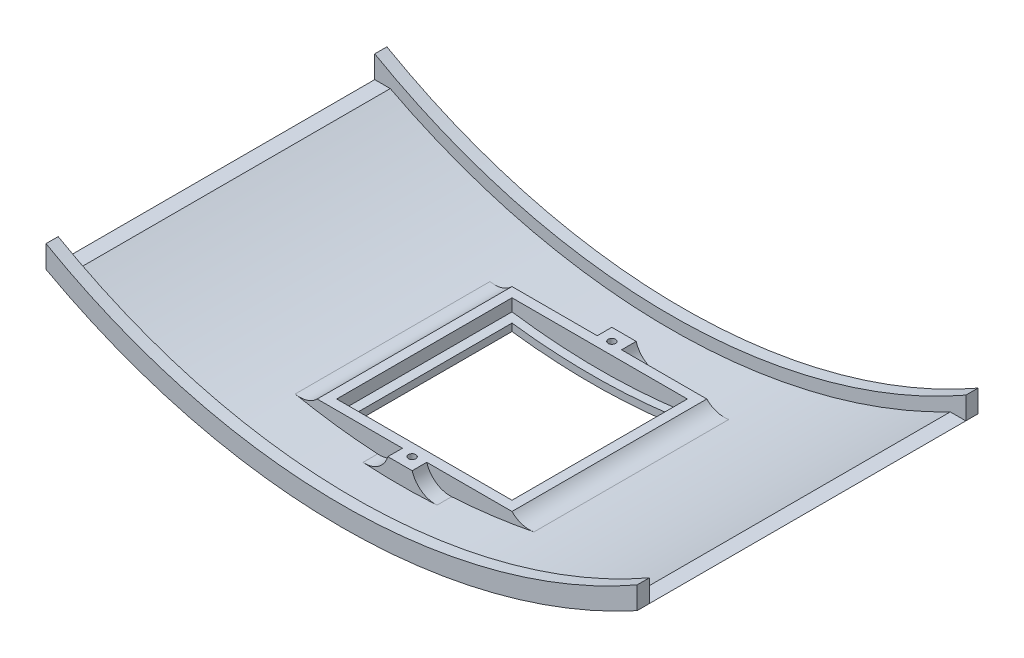
ISO-10303-21;
HEADER;
FILE_DESCRIPTION(('STEP AP214'),'2;1');
FILE_NAME('part.step','',(''),(''),'','','');
FILE_SCHEMA(('AUTOMOTIVE_DESIGN { 1 0 10303 214 1 1 1 1 }'));
ENDSEC;
DATA;
#1=APPLICATION_CONTEXT('core data for automotive mechanical design processes');
#2=APPLICATION_PROTOCOL_DEFINITION('international standard','automotive_design',2000,#1);
#3=PRODUCT_CONTEXT('',#1,'mechanical');
#4=PRODUCT('Part','Part','',(#3));
#5=PRODUCT_RELATED_PRODUCT_CATEGORY('part','',(#4));
#6=PRODUCT_DEFINITION_FORMATION('','',#4);
#7=PRODUCT_DEFINITION_CONTEXT('part definition',#1,'design');
#8=PRODUCT_DEFINITION('design','',#6,#7);
#9=PRODUCT_DEFINITION_SHAPE('','',#8);
#10=(LENGTH_UNIT() NAMED_UNIT(*) SI_UNIT(.MILLI.,.METRE.));
#11=(NAMED_UNIT(*) PLANE_ANGLE_UNIT() SI_UNIT($,.RADIAN.));
#12=(NAMED_UNIT(*) SI_UNIT($,.STERADIAN.) SOLID_ANGLE_UNIT());
#13=UNCERTAINTY_MEASURE_WITH_UNIT(LENGTH_MEASURE(1.E-05),#10,'distance_accuracy_value','');
#14=(GEOMETRIC_REPRESENTATION_CONTEXT(3) GLOBAL_UNCERTAINTY_ASSIGNED_CONTEXT((#13)) GLOBAL_UNIT_ASSIGNED_CONTEXT((#10,
#11,#12)) REPRESENTATION_CONTEXT('',''));
#15=CARTESIAN_POINT('',(0.,0.,0.));
#16=DIRECTION('',(0.,0.,1.));
#17=DIRECTION('',(1.,0.,0.));
#18=AXIS2_PLACEMENT_3D('',#15,#16,#17);
#19=CARTESIAN_POINT('',(40.,-242.39,110.));
#20=DIRECTION('',(0.,0.,1.));
#21=DIRECTION('',(1.,0.,0.));
#22=AXIS2_PLACEMENT_3D('',#19,#20,#21);
#23=PLANE('',#22);
#24=CARTESIAN_POINT('',(0.,0.,110.));
#25=DIRECTION('',(0.,0.,1.));
#26=DIRECTION('',(1.,0.,0.));
#27=AXIS2_PLACEMENT_3D('',#24,#25,#26);
#28=CIRCLE('',#27,250.);
#29=CARTESIAN_POINT('',(-49.0495078289305,-245.141073224663,110.));
#30=VERTEX_POINT('',#29);
#31=CARTESIAN_POINT('',(-15.1979695819754,-249.537615842953,110.));
#32=VERTEX_POINT('',#31);
#33=EDGE_CURVE('E356',#30,#32,#28,.T.);
#34=ORIENTED_EDGE('',*,*,#33,.T.);
#35=CARTESIAN_POINT('',(-14.5900507986964,-239.556111209235,110.));
#36=DIRECTION('',(0.,0.,1.));
#37=DIRECTION('',(1.,0.,0.));
#38=AXIS2_PLACEMENT_3D('',#35,#36,#37);
#39=CIRCLE('',#38,10.);
#40=CARTESIAN_POINT('',(-5.,-242.39,110.));
#41=VERTEX_POINT('',#40);
#42=EDGE_CURVE('E547',#32,#41,#39,.T.);
#43=ORIENTED_EDGE('',*,*,#42,.T.);
#44=DIRECTION('',(-1.,0.,0.));
#45=VECTOR('',#44,1.);
#46=CARTESIAN_POINT('',(40.,-242.39,110.));
#47=LINE('',#46,#45);
#48=CARTESIAN_POINT('',(-40.,-242.39,110.));
#49=VERTEX_POINT('',#48);
#50=EDGE_CURVE('E265',#41,#49,#47,.T.);
#51=ORIENTED_EDGE('',*,*,#50,.T.);
#52=CARTESIAN_POINT('',(-47.0875275157733,-235.335430295677,110.));
#53=DIRECTION('',(0.,0.,1.));
#54=DIRECTION('',(1.,0.,0.));
#55=AXIS2_PLACEMENT_3D('',#52,#53,#54);
#56=CIRCLE('',#55,10.);
#57=EDGE_CURVE('E247',#49,#30,#56,.F.);
#58=ORIENTED_EDGE('',*,*,#57,.T.);
#59=EDGE_LOOP('',(#34,#43,#51,#58));
#60=FACE_BOUND('',#59,.T.);
#61=ADVANCED_FACE('F40',(#60),#23,.T.);
#62=CARTESIAN_POINT('',(40.,-242.39,30.));
#63=DIRECTION('',(0.,0.,-1.));
#64=DIRECTION('',(-1.,0.,0.));
#65=AXIS2_PLACEMENT_3D('',#62,#63,#64);
#66=PLANE('',#65);
#67=CARTESIAN_POINT('',(0.,0.,30.));
#68=DIRECTION('',(0.,0.,-1.));
#69=DIRECTION('',(-1.,0.,0.));
#70=AXIS2_PLACEMENT_3D('',#67,#68,#69);
#71=CIRCLE('',#70,250.);
#72=CARTESIAN_POINT('',(49.0495078289305,-245.141073224663,30.));
#73=VERTEX_POINT('',#72);
#74=CARTESIAN_POINT('',(15.1979695819755,-249.537615842953,30.));
#75=VERTEX_POINT('',#74);
#76=EDGE_CURVE('E62',#73,#75,#71,.T.);
#77=ORIENTED_EDGE('',*,*,#76,.T.);
#78=CARTESIAN_POINT('',(14.5900507986964,-239.556111209235,30.));
#79=DIRECTION('',(0.,0.,-1.));
#80=DIRECTION('',(-1.,0.,0.));
#81=AXIS2_PLACEMENT_3D('',#78,#79,#80);
#82=CIRCLE('',#81,10.);
#83=CARTESIAN_POINT('',(5.,-242.39,30.));
#84=VERTEX_POINT('',#83);
#85=EDGE_CURVE('E541',#75,#84,#82,.T.);
#86=ORIENTED_EDGE('',*,*,#85,.T.);
#87=DIRECTION('',(1.,0.,0.));
#88=VECTOR('',#87,1.);
#89=CARTESIAN_POINT('',(40.,-242.39,30.));
#90=LINE('',#89,#88);
#91=CARTESIAN_POINT('',(40.,-242.39,30.));
#92=VERTEX_POINT('',#91);
#93=EDGE_CURVE('E334',#84,#92,#90,.T.);
#94=ORIENTED_EDGE('',*,*,#93,.T.);
#95=CARTESIAN_POINT('',(47.0875275157733,-235.335430295677,30.));
#96=DIRECTION('',(0.,0.,-1.));
#97=DIRECTION('',(-1.,0.,0.));
#98=AXIS2_PLACEMENT_3D('',#95,#96,#97);
#99=CIRCLE('',#98,10.);
#100=EDGE_CURVE('E556',#92,#73,#99,.F.);
#101=ORIENTED_EDGE('',*,*,#100,.T.);
#102=EDGE_LOOP('',(#77,#86,#94,#101));
#103=FACE_BOUND('',#102,.T.);
#104=ADVANCED_FACE('F646',(#103),#66,.T.);
#105=CARTESIAN_POINT('',(0.,-221.979728804231,140.));
#106=DIRECTION('',(0.,1.,0.));
#107=DIRECTION('',(0.,0.,1.));
#108=AXIS2_PLACEMENT_3D('',#105,#106,#107);
#109=PLANE('',#108);
#110=DIRECTION('',(0.,0.,-1.));
#111=VECTOR('',#110,1.);
#112=CARTESIAN_POINT('',(-115.,-221.979728804231,140.));
#113=LINE('',#112,#111);
#114=CARTESIAN_POINT('',(-115.,-221.979728804231,135.));
#115=VERTEX_POINT('',#114);
#116=CARTESIAN_POINT('',(-115.,-221.979728804231,5.));
#117=VERTEX_POINT('',#116);
#118=EDGE_CURVE('E480',#115,#117,#113,.T.);
#119=ORIENTED_EDGE('',*,*,#118,.T.);
#120=DIRECTION('',(1.,0.,0.));
#121=VECTOR('',#120,1.);
#122=CARTESIAN_POINT('',(0.,-221.979728804231,5.));
#123=LINE('',#122,#121);
#124=CARTESIAN_POINT('',(-121.383689184338,-221.979728804231,5.));
#125=VERTEX_POINT('',#124);
#126=EDGE_CURVE('E406',#125,#117,#123,.T.);
#127=ORIENTED_EDGE('',*,*,#126,.F.);
#128=DIRECTION('',(0.,0.,-1.));
#129=VECTOR('',#128,1.);
#130=CARTESIAN_POINT('',(-121.383689184338,-221.979728804231,140.));
#131=LINE('',#130,#129);
#132=CARTESIAN_POINT('',(-121.383689184338,-221.979728804231,135.));
#133=VERTEX_POINT('',#132);
#134=EDGE_CURVE('E496',#133,#125,#131,.T.);
#135=ORIENTED_EDGE('',*,*,#134,.F.);
#136=DIRECTION('',(-1.,0.,0.));
#137=VECTOR('',#136,1.);
#138=CARTESIAN_POINT('',(0.,-221.979728804231,135.));
#139=LINE('',#138,#137);
#140=EDGE_CURVE('E438',#115,#133,#139,.T.);
#141=ORIENTED_EDGE('',*,*,#140,.F.);
#142=EDGE_LOOP('',(#119,#127,#135,#141));
#143=FACE_BOUND('',#142,.T.);
#144=ADVANCED_FACE('F594',(#143),#109,.T.);
#145=DIRECTION('',(0.,0.,-1.));
#146=VECTOR('',#145,1.);
#147=CARTESIAN_POINT('',(121.383689184338,-221.979728804231,140.));
#148=LINE('',#147,#146);
#149=CARTESIAN_POINT('',(121.383689184338,-221.979728804231,135.));
#150=VERTEX_POINT('',#149);
#151=CARTESIAN_POINT('',(121.383689184338,-221.979728804231,5.));
#152=VERTEX_POINT('',#151);
#153=EDGE_CURVE('E491',#150,#152,#148,.T.);
#154=ORIENTED_EDGE('',*,*,#153,.T.);
#155=DIRECTION('',(1.,0.,0.));
#156=VECTOR('',#155,1.);
#157=CARTESIAN_POINT('',(0.,-221.979728804231,5.));
#158=LINE('',#157,#156);
#159=CARTESIAN_POINT('',(115.,-221.979728804231,5.));
#160=VERTEX_POINT('',#159);
#161=EDGE_CURVE('E399',#160,#152,#158,.T.);
#162=ORIENTED_EDGE('',*,*,#161,.F.);
#163=DIRECTION('',(0.,0.,-1.));
#164=VECTOR('',#163,1.);
#165=CARTESIAN_POINT('',(115.,-221.979728804231,140.));
#166=LINE('',#165,#164);
#167=CARTESIAN_POINT('',(115.,-221.979728804231,135.));
#168=VERTEX_POINT('',#167);
#169=EDGE_CURVE('E487',#168,#160,#166,.T.);
#170=ORIENTED_EDGE('',*,*,#169,.F.);
#171=DIRECTION('',(-1.,0.,0.));
#172=VECTOR('',#171,1.);
#173=CARTESIAN_POINT('',(0.,-221.979728804231,135.));
#174=LINE('',#173,#172);
#175=EDGE_CURVE('E446',#150,#168,#174,.T.);
#176=ORIENTED_EDGE('',*,*,#175,.F.);
#177=EDGE_LOOP('',(#154,#162,#170,#176));
#178=FACE_BOUND('',#177,.T.);
#179=ADVANCED_FACE('F605',(#178),#109,.T.);
#180=CARTESIAN_POINT('',(0.,0.,140.));
#181=DIRECTION('',(0.,0.,-1.));
#182=DIRECTION('',(-1.,0.,0.));
#183=AXIS2_PLACEMENT_3D('',#180,#181,#182);
#184=CYLINDRICAL_SURFACE('',#183,250.);
#185=CARTESIAN_POINT('',(0.,0.,24.));
#186=DIRECTION('',(0.,0.,-1.));
#187=DIRECTION('',(-1.,0.,0.));
#188=AXIS2_PLACEMENT_3D('',#185,#186,#187);
#189=CIRCLE('',#188,250.);
#190=CARTESIAN_POINT('',(15.1979695819755,-249.537615842953,24.));
#191=VERTEX_POINT('',#190);
#192=CARTESIAN_POINT('',(-15.1979695819754,-249.537615842953,24.));
#193=VERTEX_POINT('',#192);
#194=EDGE_CURVE('E56',#191,#193,#189,.T.);
#195=ORIENTED_EDGE('',*,*,#194,.F.);
#196=DIRECTION('',(0.,0.,-1.));
#197=VECTOR('',#196,1.);
#198=CARTESIAN_POINT('',(15.1979695819754,-249.537615842953,140.));
#199=LINE('',#198,#197);
#200=EDGE_CURVE('E538',#191,#75,#199,.F.);
#201=ORIENTED_EDGE('',*,*,#200,.T.);
#202=ORIENTED_EDGE('',*,*,#76,.F.);
#203=DIRECTION('',(0.,0.,-1.));
#204=VECTOR('',#203,1.);
#205=CARTESIAN_POINT('',(49.0495078289305,-245.141073224663,140.));
#206=LINE('',#205,#204);
#207=CARTESIAN_POINT('',(49.0495078289305,-245.141073224663,110.));
#208=VERTEX_POINT('',#207);
#209=EDGE_CURVE('E535',#73,#208,#206,.F.);
#210=ORIENTED_EDGE('',*,*,#209,.T.);
#211=CARTESIAN_POINT('',(15.1979695819754,-249.537615842953,110.));
#212=VERTEX_POINT('',#211);
#213=EDGE_CURVE('E355',#212,#208,#28,.T.);
#214=ORIENTED_EDGE('',*,*,#213,.F.);
#215=DIRECTION('',(0.,0.,-1.));
#216=VECTOR('',#215,1.);
#217=CARTESIAN_POINT('',(15.1979695819754,-249.537615842953,140.));
#218=LINE('',#217,#216);
#219=CARTESIAN_POINT('',(15.1979695819754,-249.537615842953,116.));
#220=VERTEX_POINT('',#219);
#221=EDGE_CURVE('E531',#212,#220,#218,.F.);
#222=ORIENTED_EDGE('',*,*,#221,.T.);
#223=CARTESIAN_POINT('',(0.,0.,116.));
#224=DIRECTION('',(0.,0.,1.));
#225=DIRECTION('',(1.,0.,0.));
#226=AXIS2_PLACEMENT_3D('',#223,#224,#225);
#227=CIRCLE('',#226,250.);
#228=CARTESIAN_POINT('',(-15.1979695819754,-249.537615842953,116.));
#229=VERTEX_POINT('',#228);
#230=EDGE_CURVE('E519',#229,#220,#227,.T.);
#231=ORIENTED_EDGE('',*,*,#230,.F.);
#232=DIRECTION('',(0.,0.,-1.));
#233=VECTOR('',#232,1.);
#234=CARTESIAN_POINT('',(-15.1979695819754,-249.537615842953,140.));
#235=LINE('',#234,#233);
#236=EDGE_CURVE('E244',#229,#32,#235,.T.);
#237=ORIENTED_EDGE('',*,*,#236,.T.);
#238=ORIENTED_EDGE('',*,*,#33,.F.);
#239=DIRECTION('',(0.,0.,-1.));
#240=VECTOR('',#239,1.);
#241=CARTESIAN_POINT('',(-49.0495078289305,-245.141073224663,140.));
#242=LINE('',#241,#240);
#243=CARTESIAN_POINT('',(-49.0495078289305,-245.141073224663,30.));
#244=VERTEX_POINT('',#243);
#245=EDGE_CURVE('E525',#30,#244,#242,.T.);
#246=ORIENTED_EDGE('',*,*,#245,.T.);
#247=CARTESIAN_POINT('',(-15.1979695819754,-249.537615842953,30.));
#248=VERTEX_POINT('',#247);
#249=EDGE_CURVE('E360',#248,#244,#71,.T.);
#250=ORIENTED_EDGE('',*,*,#249,.F.);
#251=DIRECTION('',(0.,0.,-1.));
#252=VECTOR('',#251,1.);
#253=CARTESIAN_POINT('',(-15.1979695819754,-249.537615842953,140.));
#254=LINE('',#253,#252);
#255=EDGE_CURVE('E522',#248,#193,#254,.T.);
#256=ORIENTED_EDGE('',*,*,#255,.T.);
#257=EDGE_LOOP('',(#195,#201,#202,#210,#214,#222,#231,#237,#238,#246,#250,#256));
#258=FACE_BOUND('',#257,.T.);
#259=ORIENTED_EDGE('',*,*,#169,.T.);
#260=CARTESIAN_POINT('',(0.,0.,5.));
#261=DIRECTION('',(0.,0.,-1.));
#262=DIRECTION('',(-1.,0.,0.));
#263=AXIS2_PLACEMENT_3D('',#260,#261,#262);
#264=CIRCLE('',#263,250.);
#265=EDGE_CURVE('E402',#160,#117,#264,.T.);
#266=ORIENTED_EDGE('',*,*,#265,.T.);
#267=ORIENTED_EDGE('',*,*,#118,.F.);
#268=CARTESIAN_POINT('',(0.,0.,135.));
#269=DIRECTION('',(0.,0.,1.));
#270=DIRECTION('',(1.,0.,0.));
#271=AXIS2_PLACEMENT_3D('',#268,#269,#270);
#272=CIRCLE('',#271,250.);
#273=EDGE_CURVE('E442',#115,#168,#272,.T.);
#274=ORIENTED_EDGE('',*,*,#273,.T.);
#275=EDGE_LOOP('',(#259,#266,#267,#274));
#276=FACE_BOUND('',#275,.T.);
#277=ADVANCED_FACE('F601',(#258,#276),#184,.F.);
#278=CARTESIAN_POINT('',(0.,0.,140.));
#279=DIRECTION('',(0.,0.,-1.));
#280=DIRECTION('',(-1.,0.,0.));
#281=AXIS2_PLACEMENT_3D('',#278,#279,#280);
#282=CYLINDRICAL_SURFACE('',#281,253.);
#283=CARTESIAN_POINT('',(0.,0.,0.));
#284=DIRECTION('',(0.,0.,1.));
#285=DIRECTION('',(1.,0.,0.));
#286=AXIS2_PLACEMENT_3D('',#283,#284,#285);
#287=CIRCLE('',#286,253.);
#288=CARTESIAN_POINT('',(-121.383689184338,-221.979728804231,0.));
#289=VERTEX_POINT('',#288);
#290=CARTESIAN_POINT('',(121.383689184338,-221.979728804231,0.));
#291=VERTEX_POINT('',#290);
#292=EDGE_CURVE('E474',#289,#291,#287,.T.);
#293=ORIENTED_EDGE('',*,*,#292,.T.);
#294=DIRECTION('',(0.,0.,-1.));
#295=VECTOR('',#294,1.);
#296=CARTESIAN_POINT('',(121.383689184338,-221.979728804231,5.));
#297=LINE('',#296,#295);
#298=EDGE_CURVE('E431',#152,#291,#297,.T.);
#299=ORIENTED_EDGE('',*,*,#298,.F.);
#300=ORIENTED_EDGE('',*,*,#153,.F.);
#301=CARTESIAN_POINT('',(121.383689184338,-221.979728804231,140.));
#302=VERTEX_POINT('',#301);
#303=EDGE_CURVE('E492',#302,#150,#148,.T.);
#304=ORIENTED_EDGE('',*,*,#303,.F.);
#305=CARTESIAN_POINT('',(0.,0.,140.));
#306=DIRECTION('',(0.,0.,1.));
#307=DIRECTION('',(1.,0.,0.));
#308=AXIS2_PLACEMENT_3D('',#305,#306,#307);
#309=CIRCLE('',#308,253.);
#310=CARTESIAN_POINT('',(-121.383689184338,-221.979728804231,140.));
#311=VERTEX_POINT('',#310);
#312=EDGE_CURVE('E477',#311,#302,#309,.T.);
#313=ORIENTED_EDGE('',*,*,#312,.F.);
#314=EDGE_CURVE('E497',#311,#133,#131,.T.);
#315=ORIENTED_EDGE('',*,*,#314,.T.);
#316=ORIENTED_EDGE('',*,*,#134,.T.);
#317=DIRECTION('',(0.,0.,-1.));
#318=VECTOR('',#317,1.);
#319=CARTESIAN_POINT('',(-121.383689184338,-221.979728804231,5.));
#320=LINE('',#319,#318);
#321=EDGE_CURVE('E427',#125,#289,#320,.T.);
#322=ORIENTED_EDGE('',*,*,#321,.T.);
#323=EDGE_LOOP('',(#293,#299,#300,#304,#313,#315,#316,#322));
#324=FACE_BOUND('',#323,.T.);
#325=DIRECTION('',(0.,0.,-1.));
#326=VECTOR('',#325,1.);
#327=CARTESIAN_POINT('',(32.5,-250.903866052319,140.));
#328=LINE('',#327,#326);
#329=CARTESIAN_POINT('',(32.5,-250.903866052319,102.5));
#330=VERTEX_POINT('',#329);
#331=CARTESIAN_POINT('',(32.5000000000001,-250.903866052319,37.5));
#332=VERTEX_POINT('',#331);
#333=EDGE_CURVE('E513',#330,#332,#328,.T.);
#334=ORIENTED_EDGE('',*,*,#333,.T.);
#335=CARTESIAN_POINT('',(0.,0.,37.5));
#336=DIRECTION('',(0.,0.,-1.));
#337=DIRECTION('',(-1.,0.,0.));
#338=AXIS2_PLACEMENT_3D('',#335,#336,#337);
#339=CIRCLE('',#338,253.);
#340=CARTESIAN_POINT('',(-32.5,-250.903866052319,37.5));
#341=VERTEX_POINT('',#340);
#342=EDGE_CURVE('E501',#332,#341,#339,.T.);
#343=ORIENTED_EDGE('',*,*,#342,.T.);
#344=DIRECTION('',(0.,0.,-1.));
#345=VECTOR('',#344,1.);
#346=CARTESIAN_POINT('',(-32.5,-250.903866052319,140.));
#347=LINE('',#346,#345);
#348=CARTESIAN_POINT('',(-32.5,-250.903866052319,102.5));
#349=VERTEX_POINT('',#348);
#350=EDGE_CURVE('E509',#341,#349,#347,.F.);
#351=ORIENTED_EDGE('',*,*,#350,.T.);
#352=CARTESIAN_POINT('',(0.,0.,102.5));
#353=DIRECTION('',(0.,0.,1.));
#354=DIRECTION('',(1.,0.,0.));
#355=AXIS2_PLACEMENT_3D('',#352,#353,#354);
#356=CIRCLE('',#355,253.);
#357=EDGE_CURVE('E505',#349,#330,#356,.T.);
#358=ORIENTED_EDGE('',*,*,#357,.T.);
#359=EDGE_LOOP('',(#334,#343,#351,#358));
#360=FACE_BOUND('',#359,.T.);
#361=ADVANCED_FACE('F587',(#324,#360),#282,.T.);
#362=CARTESIAN_POINT('',(0.,0.,140.));
#363=DIRECTION('',(0.,0.,1.));
#364=DIRECTION('',(1.,0.,0.));
#365=AXIS2_PLACEMENT_3D('',#362,#363,#364);
#366=PLANE('',#365);
#367=ORIENTED_EDGE('',*,*,#312,.T.);
#368=DIRECTION('',(0.,1.,0.));
#369=VECTOR('',#368,1.);
#370=CARTESIAN_POINT('',(121.383689184338,0.,140.));
#371=LINE('',#370,#369);
#372=CARTESIAN_POINT('',(121.383689184338,-212.816822643324,140.));
#373=VERTEX_POINT('',#372);
#374=EDGE_CURVE('E426',#302,#373,#371,.T.);
#375=ORIENTED_EDGE('',*,*,#374,.T.);
#376=CARTESIAN_POINT('',(0.,0.,140.));
#377=DIRECTION('',(0.,0.,1.));
#378=DIRECTION('',(1.,0.,0.));
#379=AXIS2_PLACEMENT_3D('',#376,#377,#378);
#380=CIRCLE('',#379,245.);
#381=CARTESIAN_POINT('',(-121.383689184338,-212.816822643324,140.));
#382=VERTEX_POINT('',#381);
#383=EDGE_CURVE('E464',#382,#373,#380,.T.);
#384=ORIENTED_EDGE('',*,*,#383,.F.);
#385=DIRECTION('',(0.,1.,0.));
#386=VECTOR('',#385,1.);
#387=CARTESIAN_POINT('',(-121.383689184338,0.,140.));
#388=LINE('',#387,#386);
#389=EDGE_CURVE('E443',#311,#382,#388,.T.);
#390=ORIENTED_EDGE('',*,*,#389,.F.);
#391=EDGE_LOOP('',(#367,#375,#384,#390));
#392=FACE_BOUND('',#391,.T.);
#393=ADVANCED_FACE('F633',(#392),#366,.T.);
#394=CARTESIAN_POINT('',(0.,0.,0.));
#395=DIRECTION('',(0.,0.,1.));
#396=DIRECTION('',(1.,0.,0.));
#397=AXIS2_PLACEMENT_3D('',#394,#395,#396);
#398=PLANE('',#397);
#399=ORIENTED_EDGE('',*,*,#292,.F.);
#400=DIRECTION('',(0.,1.,0.));
#401=VECTOR('',#400,1.);
#402=CARTESIAN_POINT('',(-121.383689184337,3.67686201789752E-13,0.));
#403=LINE('',#402,#401);
#404=CARTESIAN_POINT('',(-121.383689184338,-212.816822643324,0.));
#405=VERTEX_POINT('',#404);
#406=EDGE_CURVE('E396',#289,#405,#403,.T.);
#407=ORIENTED_EDGE('',*,*,#406,.T.);
#408=CARTESIAN_POINT('',(0.,0.,0.));
#409=DIRECTION('',(0.,0.,-1.));
#410=DIRECTION('',(-1.,0.,0.));
#411=AXIS2_PLACEMENT_3D('',#408,#409,#410);
#412=CIRCLE('',#411,245.);
#413=CARTESIAN_POINT('',(121.383689184338,-212.816822643324,0.));
#414=VERTEX_POINT('',#413);
#415=EDGE_CURVE('E391',#414,#405,#412,.T.);
#416=ORIENTED_EDGE('',*,*,#415,.F.);
#417=DIRECTION('',(0.,1.,0.));
#418=VECTOR('',#417,1.);
#419=CARTESIAN_POINT('',(121.383689184339,-3.67686201789756E-13,0.));
#420=LINE('',#419,#418);
#421=EDGE_CURVE('E417',#291,#414,#420,.T.);
#422=ORIENTED_EDGE('',*,*,#421,.F.);
#423=EDGE_LOOP('',(#399,#407,#416,#422));
#424=FACE_BOUND('',#423,.T.);
#425=ADVANCED_FACE('F630',(#424),#398,.F.);
#426=CARTESIAN_POINT('',(-121.383689184338,0.,135.));
#427=DIRECTION('',(1.,0.,0.));
#428=DIRECTION('',(0.,0.,-1.));
#429=AXIS2_PLACEMENT_3D('',#426,#427,#428);
#430=PLANE('',#429);
#431=ORIENTED_EDGE('',*,*,#389,.T.);
#432=DIRECTION('',(0.,0.,1.));
#433=VECTOR('',#432,1.);
#434=CARTESIAN_POINT('',(-121.383689184338,-212.816822643324,135.));
#435=LINE('',#434,#433);
#436=CARTESIAN_POINT('',(-121.383689184338,-212.816822643324,135.));
#437=VERTEX_POINT('',#436);
#438=EDGE_CURVE('E470',#437,#382,#435,.T.);
#439=ORIENTED_EDGE('',*,*,#438,.F.);
#440=DIRECTION('',(0.,1.,0.));
#441=VECTOR('',#440,1.);
#442=CARTESIAN_POINT('',(-121.383689184338,0.,135.));
#443=LINE('',#442,#441);
#444=EDGE_CURVE('E457',#133,#437,#443,.T.);
#445=ORIENTED_EDGE('',*,*,#444,.F.);
#446=ORIENTED_EDGE('',*,*,#314,.F.);
#447=EDGE_LOOP('',(#431,#439,#445,#446));
#448=FACE_BOUND('',#447,.T.);
#449=ADVANCED_FACE('F632',(#448),#430,.F.);
#450=CARTESIAN_POINT('',(0.,0.,135.));
#451=DIRECTION('',(0.,0.,1.));
#452=DIRECTION('',(1.,0.,0.));
#453=AXIS2_PLACEMENT_3D('',#450,#451,#452);
#454=CYLINDRICAL_SURFACE('',#453,245.);
#455=ORIENTED_EDGE('',*,*,#383,.T.);
#456=DIRECTION('',(0.,0.,1.));
#457=VECTOR('',#456,1.);
#458=CARTESIAN_POINT('',(121.383689184338,-212.816822643324,135.));
#459=LINE('',#458,#457);
#460=CARTESIAN_POINT('',(121.383689184338,-212.816822643324,135.));
#461=VERTEX_POINT('',#460);
#462=EDGE_CURVE('E460',#461,#373,#459,.T.);
#463=ORIENTED_EDGE('',*,*,#462,.F.);
#464=CARTESIAN_POINT('',(0.,0.,135.));
#465=DIRECTION('',(0.,0.,1.));
#466=DIRECTION('',(1.,0.,0.));
#467=AXIS2_PLACEMENT_3D('',#464,#465,#466);
#468=CIRCLE('',#467,245.);
#469=EDGE_CURVE('E454',#437,#461,#468,.T.);
#470=ORIENTED_EDGE('',*,*,#469,.F.);
#471=ORIENTED_EDGE('',*,*,#438,.T.);
#472=EDGE_LOOP('',(#455,#463,#470,#471));
#473=FACE_BOUND('',#472,.T.);
#474=ADVANCED_FACE('F639',(#473),#454,.F.);
#475=CARTESIAN_POINT('',(121.383689184338,0.,135.));
#476=DIRECTION('',(1.,0.,0.));
#477=DIRECTION('',(0.,0.,-1.));
#478=AXIS2_PLACEMENT_3D('',#475,#476,#477);
#479=PLANE('',#478);
#480=ORIENTED_EDGE('',*,*,#374,.F.);
#481=ORIENTED_EDGE('',*,*,#303,.T.);
#482=DIRECTION('',(0.,1.,0.));
#483=VECTOR('',#482,1.);
#484=CARTESIAN_POINT('',(121.383689184338,0.,135.));
#485=LINE('',#484,#483);
#486=EDGE_CURVE('E450',#150,#461,#485,.T.);
#487=ORIENTED_EDGE('',*,*,#486,.T.);
#488=ORIENTED_EDGE('',*,*,#462,.T.);
#489=EDGE_LOOP('',(#480,#481,#487,#488));
#490=FACE_BOUND('',#489,.T.);
#491=ADVANCED_FACE('F614',(#490),#479,.T.);
#492=CARTESIAN_POINT('',(0.,0.,135.));
#493=DIRECTION('',(0.,0.,1.));
#494=DIRECTION('',(1.,0.,0.));
#495=AXIS2_PLACEMENT_3D('',#492,#493,#494);
#496=PLANE('',#495);
#497=ORIENTED_EDGE('',*,*,#140,.T.);
#498=ORIENTED_EDGE('',*,*,#444,.T.);
#499=ORIENTED_EDGE('',*,*,#469,.T.);
#500=ORIENTED_EDGE('',*,*,#486,.F.);
#501=ORIENTED_EDGE('',*,*,#175,.T.);
#502=ORIENTED_EDGE('',*,*,#273,.F.);
#503=EDGE_LOOP('',(#497,#498,#499,#500,#501,#502));
#504=FACE_BOUND('',#503,.T.);
#505=ADVANCED_FACE('F609',(#504),#496,.F.);
#506=CARTESIAN_POINT('',(0.,0.,5.));
#507=DIRECTION('',(0.,0.,-1.));
#508=DIRECTION('',(-1.,0.,0.));
#509=AXIS2_PLACEMENT_3D('',#506,#507,#508);
#510=CYLINDRICAL_SURFACE('',#509,245.);
#511=ORIENTED_EDGE('',*,*,#415,.T.);
#512=DIRECTION('',(0.,0.,-1.));
#513=VECTOR('',#512,1.);
#514=CARTESIAN_POINT('',(-121.383689184338,-212.816822643324,5.));
#515=LINE('',#514,#513);
#516=CARTESIAN_POINT('',(-121.383689184338,-212.816822643324,5.));
#517=VERTEX_POINT('',#516);
#518=EDGE_CURVE('E423',#517,#405,#515,.T.);
#519=ORIENTED_EDGE('',*,*,#518,.F.);
#520=CARTESIAN_POINT('',(0.,0.,5.));
#521=DIRECTION('',(0.,0.,-1.));
#522=DIRECTION('',(-1.,0.,0.));
#523=AXIS2_PLACEMENT_3D('',#520,#521,#522);
#524=CIRCLE('',#523,245.);
#525=CARTESIAN_POINT('',(121.383689184338,-212.816822643324,5.));
#526=VERTEX_POINT('',#525);
#527=EDGE_CURVE('E392',#526,#517,#524,.T.);
#528=ORIENTED_EDGE('',*,*,#527,.F.);
#529=DIRECTION('',(0.,0.,-1.));
#530=VECTOR('',#529,1.);
#531=CARTESIAN_POINT('',(121.383689184338,-212.816822643324,5.));
#532=LINE('',#531,#530);
#533=EDGE_CURVE('E413',#526,#414,#532,.T.);
#534=ORIENTED_EDGE('',*,*,#533,.T.);
#535=EDGE_LOOP('',(#511,#519,#528,#534));
#536=FACE_BOUND('',#535,.T.);
#537=ADVANCED_FACE('F625',(#536),#510,.F.);
#538=CARTESIAN_POINT('',(-121.383689184337,3.67686201789752E-13,5.));
#539=DIRECTION('',(-1.,0.,0.));
#540=DIRECTION('',(0.,-1.,0.));
#541=AXIS2_PLACEMENT_3D('',#538,#539,#540);
#542=PLANE('',#541);
#543=ORIENTED_EDGE('',*,*,#406,.F.);
#544=ORIENTED_EDGE('',*,*,#321,.F.);
#545=DIRECTION('',(0.,1.,0.));
#546=VECTOR('',#545,1.);
#547=CARTESIAN_POINT('',(-121.383689184337,3.67686201789752E-13,5.));
#548=LINE('',#547,#546);
#549=EDGE_CURVE('E409',#125,#517,#548,.T.);
#550=ORIENTED_EDGE('',*,*,#549,.T.);
#551=ORIENTED_EDGE('',*,*,#518,.T.);
#552=EDGE_LOOP('',(#543,#544,#550,#551));
#553=FACE_BOUND('',#552,.T.);
#554=ADVANCED_FACE('F628',(#553),#542,.T.);
#555=CARTESIAN_POINT('',(121.383689184339,-3.67686201789756E-13,5.));
#556=DIRECTION('',(-1.,0.,0.));
#557=DIRECTION('',(0.,-1.,0.));
#558=AXIS2_PLACEMENT_3D('',#555,#556,#557);
#559=PLANE('',#558);
#560=ORIENTED_EDGE('',*,*,#421,.T.);
#561=ORIENTED_EDGE('',*,*,#533,.F.);
#562=DIRECTION('',(0.,1.,0.));
#563=VECTOR('',#562,1.);
#564=CARTESIAN_POINT('',(121.383689184339,-3.67686201789756E-13,5.));
#565=LINE('',#564,#563);
#566=EDGE_CURVE('E395',#152,#526,#565,.T.);
#567=ORIENTED_EDGE('',*,*,#566,.F.);
#568=ORIENTED_EDGE('',*,*,#298,.T.);
#569=EDGE_LOOP('',(#560,#561,#567,#568));
#570=FACE_BOUND('',#569,.T.);
#571=ADVANCED_FACE('F620',(#570),#559,.F.);
#572=CARTESIAN_POINT('',(0.,0.,5.));
#573=DIRECTION('',(0.,0.,-1.));
#574=DIRECTION('',(-1.,0.,0.));
#575=AXIS2_PLACEMENT_3D('',#572,#573,#574);
#576=PLANE('',#575);
#577=ORIENTED_EDGE('',*,*,#527,.T.);
#578=ORIENTED_EDGE('',*,*,#549,.F.);
#579=ORIENTED_EDGE('',*,*,#126,.T.);
#580=ORIENTED_EDGE('',*,*,#265,.F.);
#581=ORIENTED_EDGE('',*,*,#161,.T.);
#582=ORIENTED_EDGE('',*,*,#566,.T.);
#583=EDGE_LOOP('',(#577,#578,#579,#580,#581,#582));
#584=FACE_BOUND('',#583,.T.);
#585=ADVANCED_FACE('F598',(#584),#576,.F.);
#586=CARTESIAN_POINT('',(32.5,-212.816822643324,102.5));
#587=DIRECTION('',(0.,0.,1.));
#588=DIRECTION('',(1.,0.,0.));
#589=AXIS2_PLACEMENT_3D('',#586,#587,#588);
#590=PLANE('',#589);
#591=CARTESIAN_POINT('',(0.,0.,102.5));
#592=DIRECTION('',(0.,0.,1.));
#593=DIRECTION('',(1.,0.,0.));
#594=AXIS2_PLACEMENT_3D('',#591,#592,#593);
#595=CIRCLE('',#594,250.);
#596=CARTESIAN_POINT('',(-32.5,-247.878498462452,102.5));
#597=VERTEX_POINT('',#596);
#598=CARTESIAN_POINT('',(32.5,-247.878498462452,102.5));
#599=VERTEX_POINT('',#598);
#600=EDGE_CURVE('E385',#597,#599,#595,.T.);
#601=ORIENTED_EDGE('',*,*,#600,.T.);
#602=DIRECTION('',(0.,-1.,0.));
#603=VECTOR('',#602,1.);
#604=CARTESIAN_POINT('',(32.5,-212.816822643324,102.5));
#605=LINE('',#604,#603);
#606=EDGE_CURVE('E369',#599,#330,#605,.T.);
#607=ORIENTED_EDGE('',*,*,#606,.T.);
#608=ORIENTED_EDGE('',*,*,#357,.F.);
#609=DIRECTION('',(0.,-1.,0.));
#610=VECTOR('',#609,1.);
#611=CARTESIAN_POINT('',(-32.5,-212.816822643324,102.5));
#612=LINE('',#611,#610);
#613=EDGE_CURVE('E364',#597,#349,#612,.T.);
#614=ORIENTED_EDGE('',*,*,#613,.F.);
#615=EDGE_LOOP('',(#601,#607,#608,#614));
#616=FACE_BOUND('',#615,.T.);
#617=ADVANCED_FACE('F900',(#616),#590,.F.);
#618=CARTESIAN_POINT('',(-32.5,-212.816822643324,37.5));
#619=DIRECTION('',(-1.,0.,0.));
#620=DIRECTION('',(0.,0.,1.));
#621=AXIS2_PLACEMENT_3D('',#618,#619,#620);
#622=PLANE('',#621);
#623=DIRECTION('',(0.,0.,-1.));
#624=VECTOR('',#623,1.);
#625=CARTESIAN_POINT('',(-32.5,-247.878498462452,140.));
#626=LINE('',#625,#624);
#627=CARTESIAN_POINT('',(-32.5,-247.878498462452,37.5));
#628=VERTEX_POINT('',#627);
#629=EDGE_CURVE('E388',#628,#597,#626,.F.);
#630=ORIENTED_EDGE('',*,*,#629,.T.);
#631=ORIENTED_EDGE('',*,*,#613,.T.);
#632=ORIENTED_EDGE('',*,*,#350,.F.);
#633=DIRECTION('',(0.,-1.,0.));
#634=VECTOR('',#633,1.);
#635=CARTESIAN_POINT('',(-32.5,-212.816822643324,37.5));
#636=LINE('',#635,#634);
#637=EDGE_CURVE('E363',#628,#341,#636,.T.);
#638=ORIENTED_EDGE('',*,*,#637,.F.);
#639=EDGE_LOOP('',(#630,#631,#632,#638));
#640=FACE_BOUND('',#639,.T.);
#641=ADVANCED_FACE('F722',(#640),#622,.F.);
#642=CARTESIAN_POINT('',(32.5,-212.816822643324,37.5));
#643=DIRECTION('',(0.,0.,-1.));
#644=DIRECTION('',(-1.,0.,0.));
#645=AXIS2_PLACEMENT_3D('',#642,#643,#644);
#646=PLANE('',#645);
#647=CARTESIAN_POINT('',(0.,0.,37.5));
#648=DIRECTION('',(0.,0.,-1.));
#649=DIRECTION('',(-1.,0.,0.));
#650=AXIS2_PLACEMENT_3D('',#647,#648,#649);
#651=CIRCLE('',#650,250.);
#652=CARTESIAN_POINT('',(32.5000000000001,-247.878498462452,37.5));
#653=VERTEX_POINT('',#652);
#654=EDGE_CURVE('E368',#653,#628,#651,.T.);
#655=ORIENTED_EDGE('',*,*,#654,.T.);
#656=ORIENTED_EDGE('',*,*,#637,.T.);
#657=ORIENTED_EDGE('',*,*,#342,.F.);
#658=DIRECTION('',(0.,-1.,0.));
#659=VECTOR('',#658,1.);
#660=CARTESIAN_POINT('',(32.5,-212.816822643324,37.5));
#661=LINE('',#660,#659);
#662=EDGE_CURVE('E373',#653,#332,#661,.T.);
#663=ORIENTED_EDGE('',*,*,#662,.F.);
#664=EDGE_LOOP('',(#655,#656,#657,#663));
#665=FACE_BOUND('',#664,.T.);
#666=ADVANCED_FACE('F714',(#665),#646,.F.);
#667=ORIENTED_EDGE('',*,*,#629,.F.);
#668=ORIENTED_EDGE('',*,*,#654,.F.);
#669=DIRECTION('',(0.,0.,-1.));
#670=VECTOR('',#669,1.);
#671=CARTESIAN_POINT('',(32.5,-247.878498462452,140.));
#672=LINE('',#671,#670);
#673=EDGE_CURVE('E381',#599,#653,#672,.T.);
#674=ORIENTED_EDGE('',*,*,#673,.F.);
#675=ORIENTED_EDGE('',*,*,#600,.F.);
#676=EDGE_LOOP('',(#667,#668,#674,#675));
#677=FACE_BOUND('',#676,.T.);
#678=CARTESIAN_POINT('',(0.,0.,34.));
#679=DIRECTION('',(0.,0.,-1.));
#680=DIRECTION('',(-1.,0.,0.));
#681=AXIS2_PLACEMENT_3D('',#678,#679,#680);
#682=CIRCLE('',#681,250.);
#683=CARTESIAN_POINT('',(36.,-247.394421925798,34.));
#684=VERTEX_POINT('',#683);
#685=CARTESIAN_POINT('',(-36.,-247.394421925798,34.));
#686=VERTEX_POINT('',#685);
#687=EDGE_CURVE('E339',#684,#686,#682,.T.);
#688=ORIENTED_EDGE('',*,*,#687,.T.);
#689=DIRECTION('',(0.,0.,-1.));
#690=VECTOR('',#689,1.);
#691=CARTESIAN_POINT('',(-36.,-247.394421925798,140.));
#692=LINE('',#691,#690);
#693=CARTESIAN_POINT('',(-36.,-247.394421925798,106.));
#694=VERTEX_POINT('',#693);
#695=EDGE_CURVE('E351',#686,#694,#692,.F.);
#696=ORIENTED_EDGE('',*,*,#695,.T.);
#697=CARTESIAN_POINT('',(0.,0.,106.));
#698=DIRECTION('',(0.,0.,1.));
#699=DIRECTION('',(1.,0.,0.));
#700=AXIS2_PLACEMENT_3D('',#697,#698,#699);
#701=CIRCLE('',#700,250.);
#702=CARTESIAN_POINT('',(36.,-247.394421925798,106.));
#703=VERTEX_POINT('',#702);
#704=EDGE_CURVE('E347',#694,#703,#701,.T.);
#705=ORIENTED_EDGE('',*,*,#704,.T.);
#706=DIRECTION('',(0.,0.,-1.));
#707=VECTOR('',#706,1.);
#708=CARTESIAN_POINT('',(36.,-247.394421925798,140.));
#709=LINE('',#708,#707);
#710=EDGE_CURVE('E343',#703,#684,#709,.T.);
#711=ORIENTED_EDGE('',*,*,#710,.T.);
#712=EDGE_LOOP('',(#688,#696,#705,#711));
#713=FACE_BOUND('',#712,.T.);
#714=ADVANCED_FACE('F709',(#677,#713),#184,.F.);
#715=CARTESIAN_POINT('',(32.5,-212.816822643324,37.5));
#716=DIRECTION('',(1.,0.,0.));
#717=DIRECTION('',(0.,0.,-1.));
#718=AXIS2_PLACEMENT_3D('',#715,#716,#717);
#719=PLANE('',#718);
#720=ORIENTED_EDGE('',*,*,#673,.T.);
#721=ORIENTED_EDGE('',*,*,#662,.T.);
#722=ORIENTED_EDGE('',*,*,#333,.F.);
#723=ORIENTED_EDGE('',*,*,#606,.F.);
#724=EDGE_LOOP('',(#720,#721,#722,#723));
#725=FACE_BOUND('',#724,.T.);
#726=ADVANCED_FACE('F667',(#725),#719,.F.);
#727=CARTESIAN_POINT('',(-40.,-242.39,30.));
#728=VERTEX_POINT('',#727);
#729=CARTESIAN_POINT('',(-5.,-242.39,30.));
#730=VERTEX_POINT('',#729);
#731=EDGE_CURVE('E335',#728,#730,#90,.T.);
#732=ORIENTED_EDGE('',*,*,#731,.T.);
#733=CARTESIAN_POINT('',(-14.5900507986964,-239.556111209235,30.));
#734=DIRECTION('',(0.,0.,-1.));
#735=DIRECTION('',(-1.,0.,0.));
#736=AXIS2_PLACEMENT_3D('',#733,#734,#735);
#737=CIRCLE('',#736,10.);
#738=EDGE_CURVE('E550',#730,#248,#737,.T.);
#739=ORIENTED_EDGE('',*,*,#738,.T.);
#740=ORIENTED_EDGE('',*,*,#249,.T.);
#741=CARTESIAN_POINT('',(-47.0875275157733,-235.335430295677,30.));
#742=DIRECTION('',(0.,0.,-1.));
#743=DIRECTION('',(-1.,0.,0.));
#744=AXIS2_PLACEMENT_3D('',#741,#742,#743);
#745=CIRCLE('',#744,10.);
#746=EDGE_CURVE('E49',#244,#728,#745,.F.);
#747=ORIENTED_EDGE('',*,*,#746,.T.);
#748=EDGE_LOOP('',(#732,#739,#740,#747));
#749=FACE_BOUND('',#748,.T.);
#750=ADVANCED_FACE('F570',(#749),#66,.T.);
#751=CARTESIAN_POINT('',(40.,-242.39,110.));
#752=VERTEX_POINT('',#751);
#753=CARTESIAN_POINT('',(5.,-242.39,110.));
#754=VERTEX_POINT('',#753);
#755=EDGE_CURVE('E326',#752,#754,#47,.T.);
#756=ORIENTED_EDGE('',*,*,#755,.T.);
#757=CARTESIAN_POINT('',(14.5900507986964,-239.556111209235,110.));
#758=DIRECTION('',(0.,0.,1.));
#759=DIRECTION('',(1.,0.,0.));
#760=AXIS2_PLACEMENT_3D('',#757,#758,#759);
#761=CIRCLE('',#760,10.);
#762=EDGE_CURVE('E544',#754,#212,#761,.T.);
#763=ORIENTED_EDGE('',*,*,#762,.T.);
#764=ORIENTED_EDGE('',*,*,#213,.T.);
#765=CARTESIAN_POINT('',(47.0875275157733,-235.335430295677,110.));
#766=DIRECTION('',(0.,0.,1.));
#767=DIRECTION('',(1.,0.,0.));
#768=AXIS2_PLACEMENT_3D('',#765,#766,#767);
#769=CIRCLE('',#768,10.);
#770=EDGE_CURVE('E559',#208,#752,#769,.F.);
#771=ORIENTED_EDGE('',*,*,#770,.T.);
#772=EDGE_LOOP('',(#756,#763,#764,#771));
#773=FACE_BOUND('',#772,.T.);
#774=ADVANCED_FACE('F648',(#773),#23,.T.);
#775=CARTESIAN_POINT('',(36.,-242.39,106.));
#776=DIRECTION('',(0.,0.,1.));
#777=DIRECTION('',(1.,0.,0.));
#778=AXIS2_PLACEMENT_3D('',#775,#776,#777);
#779=PLANE('',#778);
#780=ORIENTED_EDGE('',*,*,#704,.F.);
#781=DIRECTION('',(0.,-1.,0.));
#782=VECTOR('',#781,1.);
#783=CARTESIAN_POINT('',(-36.,-242.39,106.));
#784=LINE('',#783,#782);
#785=CARTESIAN_POINT('',(-36.,-242.39,106.));
#786=VERTEX_POINT('',#785);
#787=EDGE_CURVE('E308',#786,#694,#784,.T.);
#788=ORIENTED_EDGE('',*,*,#787,.F.);
#789=DIRECTION('',(-1.,0.,0.));
#790=VECTOR('',#789,1.);
#791=CARTESIAN_POINT('',(36.,-242.39,106.));
#792=LINE('',#791,#790);
#793=CARTESIAN_POINT('',(36.,-242.39,106.));
#794=VERTEX_POINT('',#793);
#795=EDGE_CURVE('E303',#794,#786,#792,.T.);
#796=ORIENTED_EDGE('',*,*,#795,.F.);
#797=DIRECTION('',(0.,-1.,0.));
#798=VECTOR('',#797,1.);
#799=CARTESIAN_POINT('',(36.,-242.39,106.));
#800=LINE('',#799,#798);
#801=EDGE_CURVE('E313',#794,#703,#800,.T.);
#802=ORIENTED_EDGE('',*,*,#801,.T.);
#803=EDGE_LOOP('',(#780,#788,#796,#802));
#804=FACE_BOUND('',#803,.T.);
#805=ADVANCED_FACE('F657',(#804),#779,.F.);
#806=CARTESIAN_POINT('',(36.,-242.39,34.));
#807=DIRECTION('',(0.,0.,-1.));
#808=DIRECTION('',(-1.,0.,0.));
#809=AXIS2_PLACEMENT_3D('',#806,#807,#808);
#810=PLANE('',#809);
#811=ORIENTED_EDGE('',*,*,#687,.F.);
#812=DIRECTION('',(0.,-1.,0.));
#813=VECTOR('',#812,1.);
#814=CARTESIAN_POINT('',(36.,-242.39,34.));
#815=LINE('',#814,#813);
#816=CARTESIAN_POINT('',(36.,-242.39,34.));
#817=VERTEX_POINT('',#816);
#818=EDGE_CURVE('E317',#817,#684,#815,.T.);
#819=ORIENTED_EDGE('',*,*,#818,.F.);
#820=DIRECTION('',(1.,0.,0.));
#821=VECTOR('',#820,1.);
#822=CARTESIAN_POINT('',(36.,-242.39,34.));
#823=LINE('',#822,#821);
#824=CARTESIAN_POINT('',(-36.,-242.39,34.));
#825=VERTEX_POINT('',#824);
#826=EDGE_CURVE('E295',#825,#817,#823,.T.);
#827=ORIENTED_EDGE('',*,*,#826,.F.);
#828=DIRECTION('',(0.,-1.,0.));
#829=VECTOR('',#828,1.);
#830=CARTESIAN_POINT('',(-36.,-242.39,34.));
#831=LINE('',#830,#829);
#832=EDGE_CURVE('E307',#825,#686,#831,.T.);
#833=ORIENTED_EDGE('',*,*,#832,.T.);
#834=EDGE_LOOP('',(#811,#819,#827,#833));
#835=FACE_BOUND('',#834,.T.);
#836=ADVANCED_FACE('F664',(#835),#810,.F.);
#837=CARTESIAN_POINT('',(0.,-242.39,0.));
#838=DIRECTION('',(0.,-1.,0.));
#839=DIRECTION('',(0.,0.,-1.));
#840=AXIS2_PLACEMENT_3D('',#837,#838,#839);
#841=PLANE('',#840);
#842=CARTESIAN_POINT('',(0.,-242.39,29.));
#843=DIRECTION('',(0.,1.,0.));
#844=DIRECTION('',(0.,0.,1.));
#845=AXIS2_PLACEMENT_3D('',#842,#843,#844);
#846=CIRCLE('',#845,1.5);
#847=CARTESIAN_POINT('',(0.,-242.39,30.5));
#848=VERTEX_POINT('',#847);
#849=EDGE_CURVE('E271',#848,#848,#846,.T.);
#850=ORIENTED_EDGE('',*,*,#849,.F.);
#851=EDGE_LOOP('',(#850));
#852=FACE_BOUND('',#851,.T.);
#853=CARTESIAN_POINT('',(0.,-242.39,111.));
#854=DIRECTION('',(0.,1.,0.));
#855=DIRECTION('',(0.,0.,1.));
#856=AXIS2_PLACEMENT_3D('',#853,#854,#855);
#857=CIRCLE('',#856,1.5);
#858=CARTESIAN_POINT('',(0.,-242.39,112.5));
#859=VERTEX_POINT('',#858);
#860=EDGE_CURVE('E274',#859,#859,#857,.T.);
#861=ORIENTED_EDGE('',*,*,#860,.F.);
#862=EDGE_LOOP('',(#861));
#863=FACE_BOUND('',#862,.T.);
#864=ORIENTED_EDGE('',*,*,#795,.T.);
#865=DIRECTION('',(0.,0.,-1.));
#866=VECTOR('',#865,1.);
#867=CARTESIAN_POINT('',(-36.,-242.39,34.));
#868=LINE('',#867,#866);
#869=EDGE_CURVE('E291',#786,#825,#868,.T.);
#870=ORIENTED_EDGE('',*,*,#869,.T.);
#871=ORIENTED_EDGE('',*,*,#826,.T.);
#872=DIRECTION('',(0.,0.,1.));
#873=VECTOR('',#872,1.);
#874=CARTESIAN_POINT('',(36.,-242.39,34.));
#875=LINE('',#874,#873);
#876=EDGE_CURVE('E299',#817,#794,#875,.T.);
#877=ORIENTED_EDGE('',*,*,#876,.T.);
#878=EDGE_LOOP('',(#864,#870,#871,#877));
#879=FACE_BOUND('',#878,.T.);
#880=DIRECTION('',(0.,0.,1.));
#881=VECTOR('',#880,1.);
#882=CARTESIAN_POINT('',(40.,-242.39,30.));
#883=LINE('',#882,#881);
#884=EDGE_CURVE('E312',#92,#752,#883,.T.);
#885=ORIENTED_EDGE('',*,*,#884,.F.);
#886=ORIENTED_EDGE('',*,*,#93,.F.);
#887=DIRECTION('',(0.,0.,-1.));
#888=VECTOR('',#887,1.);
#889=CARTESIAN_POINT('',(5.,-242.39,24.));
#890=LINE('',#889,#888);
#891=CARTESIAN_POINT('',(5.,-242.39,24.));
#892=VERTEX_POINT('',#891);
#893=EDGE_CURVE('E287',#84,#892,#890,.T.);
#894=ORIENTED_EDGE('',*,*,#893,.T.);
#895=DIRECTION('',(-1.,0.,0.));
#896=VECTOR('',#895,1.);
#897=CARTESIAN_POINT('',(-5.,-242.39,24.));
#898=LINE('',#897,#896);
#899=CARTESIAN_POINT('',(-5.,-242.39,24.));
#900=VERTEX_POINT('',#899);
#901=EDGE_CURVE('E279',#892,#900,#898,.T.);
#902=ORIENTED_EDGE('',*,*,#901,.T.);
#903=DIRECTION('',(0.,0.,1.));
#904=VECTOR('',#903,1.);
#905=CARTESIAN_POINT('',(-5.,-242.39,24.));
#906=LINE('',#905,#904);
#907=EDGE_CURVE('E283',#900,#730,#906,.T.);
#908=ORIENTED_EDGE('',*,*,#907,.T.);
#909=ORIENTED_EDGE('',*,*,#731,.F.);
#910=DIRECTION('',(0.,0.,-1.));
#911=VECTOR('',#910,1.);
#912=CARTESIAN_POINT('',(-40.,-242.39,30.));
#913=LINE('',#912,#911);
#914=EDGE_CURVE('E330',#49,#728,#913,.T.);
#915=ORIENTED_EDGE('',*,*,#914,.F.);
#916=ORIENTED_EDGE('',*,*,#50,.F.);
#917=DIRECTION('',(0.,0.,1.));
#918=VECTOR('',#917,1.);
#919=CARTESIAN_POINT('',(-5.,-242.39,116.));
#920=LINE('',#919,#918);
#921=CARTESIAN_POINT('',(-5.,-242.39,116.));
#922=VERTEX_POINT('',#921);
#923=EDGE_CURVE('E243',#41,#922,#920,.T.);
#924=ORIENTED_EDGE('',*,*,#923,.T.);
#925=DIRECTION('',(1.,0.,0.));
#926=VECTOR('',#925,1.);
#927=CARTESIAN_POINT('',(-5.,-242.39,116.));
#928=LINE('',#927,#926);
#929=CARTESIAN_POINT('',(5.,-242.39,116.));
#930=VERTEX_POINT('',#929);
#931=EDGE_CURVE('E251',#922,#930,#928,.T.);
#932=ORIENTED_EDGE('',*,*,#931,.T.);
#933=DIRECTION('',(0.,0.,-1.));
#934=VECTOR('',#933,1.);
#935=CARTESIAN_POINT('',(5.,-242.39,116.));
#936=LINE('',#935,#934);
#937=EDGE_CURVE('E258',#930,#754,#936,.T.);
#938=ORIENTED_EDGE('',*,*,#937,.T.);
#939=ORIENTED_EDGE('',*,*,#755,.F.);
#940=EDGE_LOOP('',(#885,#886,#894,#902,#908,#909,#915,#916,#924,#932,#938,#939));
#941=FACE_BOUND('',#940,.T.);
#942=ADVANCED_FACE('F262',(#852,#863,#879,#941),#841,.F.);
#943=CARTESIAN_POINT('',(-36.,-242.39,34.));
#944=DIRECTION('',(-1.,0.,0.));
#945=DIRECTION('',(0.,0.,1.));
#946=AXIS2_PLACEMENT_3D('',#943,#944,#945);
#947=PLANE('',#946);
#948=ORIENTED_EDGE('',*,*,#695,.F.);
#949=ORIENTED_EDGE('',*,*,#832,.F.);
#950=ORIENTED_EDGE('',*,*,#869,.F.);
#951=ORIENTED_EDGE('',*,*,#787,.T.);
#952=EDGE_LOOP('',(#948,#949,#950,#951));
#953=FACE_BOUND('',#952,.T.);
#954=ADVANCED_FACE('F739',(#953),#947,.F.);
#955=CARTESIAN_POINT('',(36.,-242.39,34.));
#956=DIRECTION('',(1.,0.,0.));
#957=DIRECTION('',(0.,1.,0.));
#958=AXIS2_PLACEMENT_3D('',#955,#956,#957);
#959=PLANE('',#958);
#960=ORIENTED_EDGE('',*,*,#710,.F.);
#961=ORIENTED_EDGE('',*,*,#801,.F.);
#962=ORIENTED_EDGE('',*,*,#876,.F.);
#963=ORIENTED_EDGE('',*,*,#818,.T.);
#964=EDGE_LOOP('',(#960,#961,#962,#963));
#965=FACE_BOUND('',#964,.T.);
#966=ADVANCED_FACE('F734',(#965),#959,.F.);
#967=CARTESIAN_POINT('',(-5.,-250.39,24.));
#968=DIRECTION('',(0.,0.,-1.));
#969=DIRECTION('',(-1.,0.,0.));
#970=AXIS2_PLACEMENT_3D('',#967,#968,#969);
#971=PLANE('',#970);
#972=ORIENTED_EDGE('',*,*,#901,.F.);
#973=CARTESIAN_POINT('',(14.5900507986964,-239.556111209235,24.));
#974=DIRECTION('',(0.,0.,-1.));
#975=DIRECTION('',(-1.,0.,0.));
#976=AXIS2_PLACEMENT_3D('',#973,#974,#975);
#977=CIRCLE('',#976,10.);
#978=EDGE_CURVE('E553',#892,#191,#977,.F.);
#979=ORIENTED_EDGE('',*,*,#978,.T.);
#980=ORIENTED_EDGE('',*,*,#194,.T.);
#981=CARTESIAN_POINT('',(-14.5900507986964,-239.556111209235,24.));
#982=DIRECTION('',(0.,0.,-1.));
#983=DIRECTION('',(-1.,0.,0.));
#984=AXIS2_PLACEMENT_3D('',#981,#982,#983);
#985=CIRCLE('',#984,10.);
#986=EDGE_CURVE('E11',#193,#900,#985,.F.);
#987=ORIENTED_EDGE('',*,*,#986,.T.);
#988=EDGE_LOOP('',(#972,#979,#980,#987));
#989=FACE_BOUND('',#988,.T.);
#990=ADVANCED_FACE('F685',(#989),#971,.T.);
#991=CARTESIAN_POINT('',(-5.,-250.39,116.));
#992=DIRECTION('',(0.,0.,1.));
#993=DIRECTION('',(1.,0.,0.));
#994=AXIS2_PLACEMENT_3D('',#991,#992,#993);
#995=PLANE('',#994);
#996=ORIENTED_EDGE('',*,*,#931,.F.);
#997=CARTESIAN_POINT('',(-14.5900507986964,-239.556111209235,116.));
#998=DIRECTION('',(0.,0.,1.));
#999=DIRECTION('',(1.,0.,0.));
#1000=AXIS2_PLACEMENT_3D('',#997,#998,#999);
#1001=CIRCLE('',#1000,10.);
#1002=EDGE_CURVE('E238',#922,#229,#1001,.F.);
#1003=ORIENTED_EDGE('',*,*,#1002,.T.);
#1004=ORIENTED_EDGE('',*,*,#230,.T.);
#1005=CARTESIAN_POINT('',(14.5900507986964,-239.556111209235,116.));
#1006=DIRECTION('',(0.,0.,1.));
#1007=DIRECTION('',(1.,0.,0.));
#1008=AXIS2_PLACEMENT_3D('',#1005,#1006,#1007);
#1009=CIRCLE('',#1008,10.);
#1010=EDGE_CURVE('E248',#220,#930,#1009,.F.);
#1011=ORIENTED_EDGE('',*,*,#1010,.T.);
#1012=EDGE_LOOP('',(#996,#1003,#1004,#1011));
#1013=FACE_BOUND('',#1012,.T.);
#1014=ADVANCED_FACE('F252',(#1013),#995,.T.);
#1015=CARTESIAN_POINT('',(0.,-247.39,111.));
#1016=DIRECTION('',(0.,1.,0.));
#1017=DIRECTION('',(0.,0.,1.));
#1018=AXIS2_PLACEMENT_3D('',#1015,#1016,#1017);
#1019=CYLINDRICAL_SURFACE('',#1018,1.5);
#1020=CARTESIAN_POINT('',(0.,-247.39,111.));
#1021=DIRECTION('',(0.,1.,0.));
#1022=DIRECTION('',(0.,0.,1.));
#1023=AXIS2_PLACEMENT_3D('',#1020,#1021,#1022);
#1024=CIRCLE('',#1023,1.5);
#1025=CARTESIAN_POINT('',(0.,-247.39,112.5));
#1026=VERTEX_POINT('',#1025);
#1027=EDGE_CURVE('E777',#1026,#1026,#1024,.T.);
#1028=ORIENTED_EDGE('',*,*,#1027,.F.);
#1029=EDGE_LOOP('',(#1028));
#1030=FACE_BOUND('',#1029,.T.);
#1031=ORIENTED_EDGE('',*,*,#860,.T.);
#1032=EDGE_LOOP('',(#1031));
#1033=FACE_BOUND('',#1032,.T.);
#1034=ADVANCED_FACE('F756',(#1030,#1033),#1019,.F.);
#1035=CARTESIAN_POINT('',(0.,-247.39,111.));
#1036=DIRECTION('',(0.,1.,0.));
#1037=DIRECTION('',(0.,0.,1.));
#1038=AXIS2_PLACEMENT_3D('',#1035,#1036,#1037);
#1039=PLANE('',#1038);
#1040=ORIENTED_EDGE('',*,*,#1027,.T.);
#1041=EDGE_LOOP('',(#1040));
#1042=FACE_BOUND('',#1041,.T.);
#1043=ADVANCED_FACE('F759',(#1042),#1039,.T.);
#1044=CARTESIAN_POINT('',(0.,-247.39,29.));
#1045=DIRECTION('',(0.,1.,0.));
#1046=DIRECTION('',(0.,0.,1.));
#1047=AXIS2_PLACEMENT_3D('',#1044,#1045,#1046);
#1048=CYLINDRICAL_SURFACE('',#1047,1.5);
#1049=CARTESIAN_POINT('',(0.,-247.39,29.));
#1050=DIRECTION('',(0.,1.,0.));
#1051=DIRECTION('',(0.,0.,1.));
#1052=AXIS2_PLACEMENT_3D('',#1049,#1050,#1051);
#1053=CIRCLE('',#1052,1.5);
#1054=CARTESIAN_POINT('',(0.,-247.39,30.5));
#1055=VERTEX_POINT('',#1054);
#1056=EDGE_CURVE('E267',#1055,#1055,#1053,.T.);
#1057=ORIENTED_EDGE('',*,*,#1056,.F.);
#1058=EDGE_LOOP('',(#1057));
#1059=FACE_BOUND('',#1058,.T.);
#1060=ORIENTED_EDGE('',*,*,#849,.T.);
#1061=EDGE_LOOP('',(#1060));
#1062=FACE_BOUND('',#1061,.T.);
#1063=ADVANCED_FACE('F763',(#1059,#1062),#1048,.F.);
#1064=CARTESIAN_POINT('',(0.,-247.39,29.));
#1065=DIRECTION('',(0.,1.,0.));
#1066=DIRECTION('',(0.,0.,1.));
#1067=AXIS2_PLACEMENT_3D('',#1064,#1065,#1066);
#1068=PLANE('',#1067);
#1069=ORIENTED_EDGE('',*,*,#1056,.T.);
#1070=EDGE_LOOP('',(#1069));
#1071=FACE_BOUND('',#1070,.T.);
#1072=ADVANCED_FACE('F704',(#1071),#1068,.T.);
#1073=CARTESIAN_POINT('',(14.5900507986964,-239.556111209235,140.));
#1074=DIRECTION('',(0.,0.,-1.));
#1075=DIRECTION('',(-1.,0.,0.));
#1076=AXIS2_PLACEMENT_3D('',#1073,#1074,#1075);
#1077=CYLINDRICAL_SURFACE('',#1076,10.);
#1078=ORIENTED_EDGE('',*,*,#85,.F.);
#1079=ORIENTED_EDGE('',*,*,#200,.F.);
#1080=ORIENTED_EDGE('',*,*,#978,.F.);
#1081=ORIENTED_EDGE('',*,*,#893,.F.);
#1082=EDGE_LOOP('',(#1078,#1079,#1080,#1081));
#1083=FACE_BOUND('',#1082,.T.);
#1084=ADVANCED_FACE('F681',(#1083),#1077,.F.);
#1085=CARTESIAN_POINT('',(47.0875275157733,-235.335430295677,140.));
#1086=DIRECTION('',(0.,0.,-1.));
#1087=DIRECTION('',(-1.,0.,0.));
#1088=AXIS2_PLACEMENT_3D('',#1085,#1086,#1087);
#1089=CYLINDRICAL_SURFACE('',#1088,10.);
#1090=ORIENTED_EDGE('',*,*,#770,.F.);
#1091=ORIENTED_EDGE('',*,*,#209,.F.);
#1092=ORIENTED_EDGE('',*,*,#100,.F.);
#1093=ORIENTED_EDGE('',*,*,#884,.T.);
#1094=EDGE_LOOP('',(#1090,#1091,#1092,#1093));
#1095=FACE_BOUND('',#1094,.T.);
#1096=ADVANCED_FACE('F676',(#1095),#1089,.F.);
#1097=CARTESIAN_POINT('',(14.5900507986964,-239.556111209235,140.));
#1098=DIRECTION('',(0.,0.,-1.));
#1099=DIRECTION('',(-1.,0.,0.));
#1100=AXIS2_PLACEMENT_3D('',#1097,#1098,#1099);
#1101=CYLINDRICAL_SURFACE('',#1100,10.);
#1102=ORIENTED_EDGE('',*,*,#1010,.F.);
#1103=ORIENTED_EDGE('',*,*,#221,.F.);
#1104=ORIENTED_EDGE('',*,*,#762,.F.);
#1105=ORIENTED_EDGE('',*,*,#937,.F.);
#1106=EDGE_LOOP('',(#1102,#1103,#1104,#1105));
#1107=FACE_BOUND('',#1106,.T.);
#1108=ADVANCED_FACE('F672',(#1107),#1101,.F.);
#1109=CARTESIAN_POINT('',(-14.5900507986964,-239.556111209235,140.));
#1110=DIRECTION('',(0.,0.,1.));
#1111=DIRECTION('',(1.,0.,0.));
#1112=AXIS2_PLACEMENT_3D('',#1109,#1110,#1111);
#1113=CYLINDRICAL_SURFACE('',#1112,10.);
#1114=ORIENTED_EDGE('',*,*,#42,.F.);
#1115=ORIENTED_EDGE('',*,*,#236,.F.);
#1116=ORIENTED_EDGE('',*,*,#1002,.F.);
#1117=ORIENTED_EDGE('',*,*,#923,.F.);
#1118=EDGE_LOOP('',(#1114,#1115,#1116,#1117));
#1119=FACE_BOUND('',#1118,.T.);
#1120=ADVANCED_FACE('F241',(#1119),#1113,.F.);
#1121=CARTESIAN_POINT('',(-47.0875275157733,-235.335430295677,140.));
#1122=DIRECTION('',(0.,0.,1.));
#1123=DIRECTION('',(1.,0.,0.));
#1124=AXIS2_PLACEMENT_3D('',#1121,#1122,#1123);
#1125=CYLINDRICAL_SURFACE('',#1124,10.);
#1126=ORIENTED_EDGE('',*,*,#746,.F.);
#1127=ORIENTED_EDGE('',*,*,#245,.F.);
#1128=ORIENTED_EDGE('',*,*,#57,.F.);
#1129=ORIENTED_EDGE('',*,*,#914,.T.);
#1130=EDGE_LOOP('',(#1126,#1127,#1128,#1129));
#1131=FACE_BOUND('',#1130,.T.);
#1132=ADVANCED_FACE('F575',(#1131),#1125,.F.);
#1133=CARTESIAN_POINT('',(-14.5900507986964,-239.556111209235,140.));
#1134=DIRECTION('',(0.,0.,1.));
#1135=DIRECTION('',(1.,0.,0.));
#1136=AXIS2_PLACEMENT_3D('',#1133,#1134,#1135);
#1137=CYLINDRICAL_SURFACE('',#1136,10.);
#1138=ORIENTED_EDGE('',*,*,#986,.F.);
#1139=ORIENTED_EDGE('',*,*,#255,.F.);
#1140=ORIENTED_EDGE('',*,*,#738,.F.);
#1141=ORIENTED_EDGE('',*,*,#907,.F.);
#1142=EDGE_LOOP('',(#1138,#1139,#1140,#1141));
#1143=FACE_BOUND('',#1142,.T.);
#1144=ADVANCED_FACE('F42',(#1143),#1137,.F.);
#1145=CLOSED_SHELL('',(#61,#104,#144,#179,#277,#361,#393,#425,#449,#474,#491,#505,#537,#554,
#571,#585,#617,#641,#666,#714,#726,#750,#774,#805,#836,#942,#954,#966,#990,#1014,#1034,#1043,
#1063,#1072,#1084,#1096,#1108,#1120,#1132,#1144));
#1146=MANIFOLD_SOLID_BREP('B2',#1145);
#1147=ADVANCED_BREP_SHAPE_REPRESENTATION('',(#18,#1146),#14);
#1148=SHAPE_DEFINITION_REPRESENTATION(#9,#1147);
ENDSEC;
END-ISO-10303-21;
